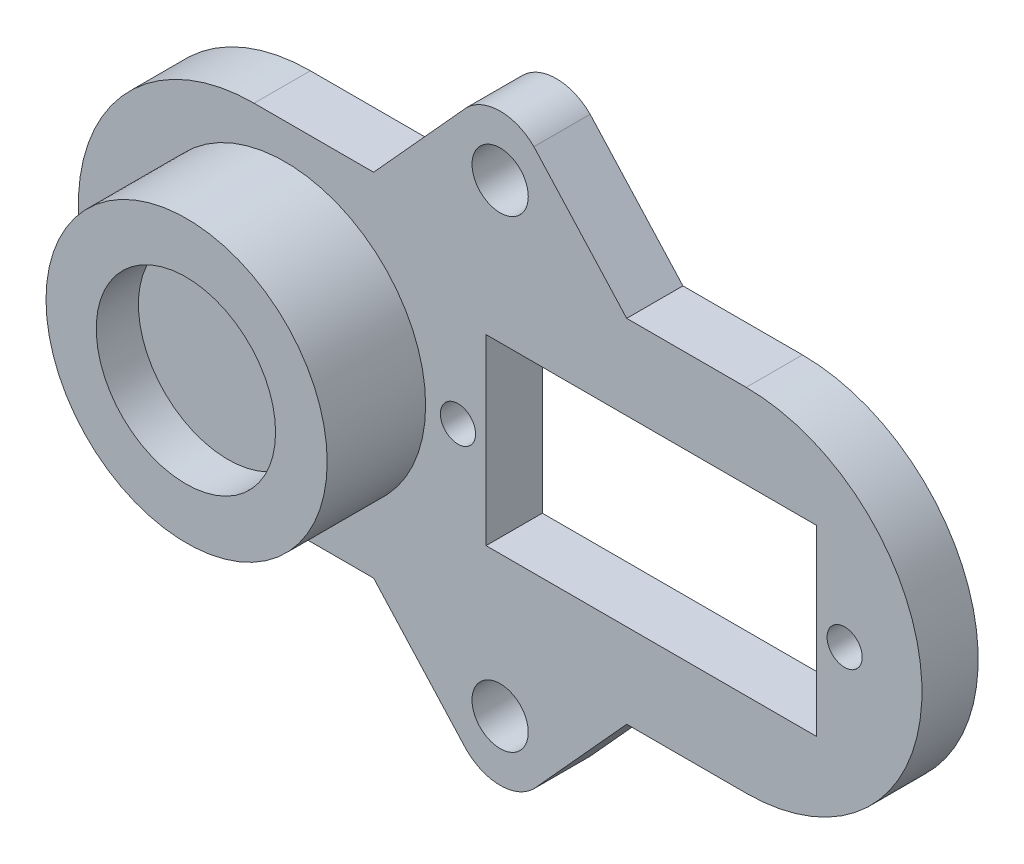
ISO-10303-21;
HEADER;
FILE_DESCRIPTION(('STEP AP214'),'2;1');
FILE_NAME('part.step','',(''),(''),'','','');
FILE_SCHEMA(('AUTOMOTIVE_DESIGN { 1 0 10303 214 1 1 1 1 }'));
ENDSEC;
DATA;
#1=APPLICATION_CONTEXT('core data for automotive mechanical design processes');
#2=APPLICATION_PROTOCOL_DEFINITION('international standard','automotive_design',2000,#1);
#3=PRODUCT_CONTEXT('',#1,'mechanical');
#4=PRODUCT('Part','Part','',(#3));
#5=PRODUCT_RELATED_PRODUCT_CATEGORY('part','',(#4));
#6=PRODUCT_DEFINITION_FORMATION('','',#4);
#7=PRODUCT_DEFINITION_CONTEXT('part definition',#1,'design');
#8=PRODUCT_DEFINITION('design','',#6,#7);
#9=PRODUCT_DEFINITION_SHAPE('','',#8);
#10=(LENGTH_UNIT() NAMED_UNIT(*) SI_UNIT(.MILLI.,.METRE.));
#11=(NAMED_UNIT(*) PLANE_ANGLE_UNIT() SI_UNIT($,.RADIAN.));
#12=(NAMED_UNIT(*) SI_UNIT($,.STERADIAN.) SOLID_ANGLE_UNIT());
#13=UNCERTAINTY_MEASURE_WITH_UNIT(LENGTH_MEASURE(1.E-05),#10,'distance_accuracy_value','');
#14=(GEOMETRIC_REPRESENTATION_CONTEXT(3) GLOBAL_UNCERTAINTY_ASSIGNED_CONTEXT((#13)) GLOBAL_UNIT_ASSIGNED_CONTEXT((#10,
#11,#12)) REPRESENTATION_CONTEXT('',''));
#15=CARTESIAN_POINT('',(0.,0.,0.));
#16=DIRECTION('',(0.,0.,1.));
#17=DIRECTION('',(1.,0.,0.));
#18=AXIS2_PLACEMENT_3D('',#15,#16,#17);
#19=CARTESIAN_POINT('',(17.5,0.,4.));
#20=DIRECTION('',(0.,0.,1.));
#21=DIRECTION('',(1.,0.,0.));
#22=AXIS2_PLACEMENT_3D('',#19,#20,#21);
#23=PLANE('',#22);
#24=CARTESIAN_POINT('',(-15.3,0.,4.));
#25=DIRECTION('',(0.,0.,1.));
#26=DIRECTION('',(1.,0.,0.));
#27=AXIS2_PLACEMENT_3D('',#24,#25,#26);
#28=CIRCLE('',#27,10.);
#29=CARTESIAN_POINT('',(-5.3,0.,4.));
#30=VERTEX_POINT('',#29);
#31=EDGE_CURVE('E582',#30,#30,#28,.T.);
#32=ORIENTED_EDGE('',*,*,#31,.F.);
#33=EDGE_LOOP('',(#32));
#34=FACE_BOUND('',#33,.T.);
#35=CARTESIAN_POINT('',(0.,-16.5,4.));
#36=DIRECTION('',(0.,0.,1.));
#37=DIRECTION('',(-1.,0.,0.));
#38=AXIS2_PLACEMENT_3D('',#35,#36,#37);
#39=CIRCLE('',#38,2.);
#40=CARTESIAN_POINT('',(-2.,-16.5,4.));
#41=VERTEX_POINT('',#40);
#42=EDGE_CURVE('E191',#41,#41,#39,.T.);
#43=ORIENTED_EDGE('',*,*,#42,.F.);
#44=EDGE_LOOP('',(#43));
#45=FACE_BOUND('',#44,.T.);
#46=CARTESIAN_POINT('',(-2.99999999999999,0.,4.));
#47=DIRECTION('',(0.,0.,1.));
#48=DIRECTION('',(1.,0.,0.));
#49=AXIS2_PLACEMENT_3D('',#46,#47,#48);
#50=CIRCLE('',#49,1.25);
#51=CARTESIAN_POINT('',(-1.74999999999999,0.,4.));
#52=VERTEX_POINT('',#51);
#53=EDGE_CURVE('E203',#52,#52,#50,.T.);
#54=ORIENTED_EDGE('',*,*,#53,.F.);
#55=EDGE_LOOP('',(#54));
#56=FACE_BOUND('',#55,.T.);
#57=CARTESIAN_POINT('',(17.5,0.,4.));
#58=DIRECTION('',(0.,0.,1.));
#59=DIRECTION('',(1.,0.,0.));
#60=AXIS2_PLACEMENT_3D('',#57,#58,#59);
#61=CIRCLE('',#60,12.5);
#62=CARTESIAN_POINT('',(17.5,-12.5,4.));
#63=VERTEX_POINT('',#62);
#64=CARTESIAN_POINT('',(17.5,12.5,4.));
#65=VERTEX_POINT('',#64);
#66=EDGE_CURVE('E209',#63,#65,#61,.T.);
#67=ORIENTED_EDGE('',*,*,#66,.T.);
#68=DIRECTION('',(-1.,0.,0.));
#69=VECTOR('',#68,1.);
#70=CARTESIAN_POINT('',(9.,12.5,4.));
#71=LINE('',#70,#69);
#72=CARTESIAN_POINT('',(9.,12.5,4.));
#73=VERTEX_POINT('',#72);
#74=EDGE_CURVE('E212',#65,#73,#71,.T.);
#75=ORIENTED_EDGE('',*,*,#74,.T.);
#76=DIRECTION('',(-0.671988671110962,0.740561426148111,0.));
#77=VECTOR('',#76,1.);
#78=CARTESIAN_POINT('',(2.4010102843855,19.772380391254,4.));
#79=LINE('',#78,#77);
#80=CARTESIAN_POINT('',(2.4010102843855,19.772380391254,4.));
#81=VERTEX_POINT('',#80);
#82=EDGE_CURVE('E215',#73,#81,#79,.T.);
#83=ORIENTED_EDGE('',*,*,#82,.T.);
#84=CARTESIAN_POINT('',(0.,17.3713701068685,4.));
#85=DIRECTION('',(0.,0.,1.));
#86=DIRECTION('',(-1.,0.,0.));
#87=AXIS2_PLACEMENT_3D('',#84,#85,#86);
#88=CIRCLE('',#87,3.39554130757526);
#89=CARTESIAN_POINT('',(-2.4010102843855,19.772380391254,4.));
#90=VERTEX_POINT('',#89);
#91=EDGE_CURVE('E217',#81,#90,#88,.T.);
#92=ORIENTED_EDGE('',*,*,#91,.T.);
#93=DIRECTION('',(-0.671988671110962,-0.740561426148111,0.));
#94=VECTOR('',#93,1.);
#95=CARTESIAN_POINT('',(-9.,12.5,4.));
#96=LINE('',#95,#94);
#97=CARTESIAN_POINT('',(-9.,12.5,4.));
#98=VERTEX_POINT('',#97);
#99=EDGE_CURVE('E219',#90,#98,#96,.T.);
#100=ORIENTED_EDGE('',*,*,#99,.T.);
#101=DIRECTION('',(-1.,0.,0.));
#102=VECTOR('',#101,1.);
#103=CARTESIAN_POINT('',(-17.5,12.5,4.));
#104=LINE('',#103,#102);
#105=CARTESIAN_POINT('',(-17.5,12.5,4.));
#106=VERTEX_POINT('',#105);
#107=EDGE_CURVE('E221',#98,#106,#104,.T.);
#108=ORIENTED_EDGE('',*,*,#107,.T.);
#109=CARTESIAN_POINT('',(-17.5,0.,4.));
#110=DIRECTION('',(0.,0.,1.));
#111=DIRECTION('',(1.,0.,0.));
#112=AXIS2_PLACEMENT_3D('',#109,#110,#111);
#113=CIRCLE('',#112,12.5);
#114=CARTESIAN_POINT('',(-17.5,-12.5,4.));
#115=VERTEX_POINT('',#114);
#116=EDGE_CURVE('E223',#106,#115,#113,.T.);
#117=ORIENTED_EDGE('',*,*,#116,.T.);
#118=DIRECTION('',(1.,0.,0.));
#119=VECTOR('',#118,1.);
#120=CARTESIAN_POINT('',(-17.5,-12.5,4.));
#121=LINE('',#120,#119);
#122=CARTESIAN_POINT('',(-9.,-12.5,4.));
#123=VERTEX_POINT('',#122);
#124=EDGE_CURVE('E225',#115,#123,#121,.T.);
#125=ORIENTED_EDGE('',*,*,#124,.T.);
#126=DIRECTION('',(0.671988671110962,-0.740561426148111,0.));
#127=VECTOR('',#126,1.);
#128=CARTESIAN_POINT('',(-9.,-12.5,4.));
#129=LINE('',#128,#127);
#130=CARTESIAN_POINT('',(-2.4010102843855,-19.772380391254,4.));
#131=VERTEX_POINT('',#130);
#132=EDGE_CURVE('E227',#123,#131,#129,.T.);
#133=ORIENTED_EDGE('',*,*,#132,.T.);
#134=CARTESIAN_POINT('',(0.,-17.3713701068685,4.));
#135=DIRECTION('',(0.,0.,1.));
#136=DIRECTION('',(1.,0.,0.));
#137=AXIS2_PLACEMENT_3D('',#134,#135,#136);
#138=CIRCLE('',#137,3.39554130757526);
#139=CARTESIAN_POINT('',(2.4010102843855,-19.772380391254,4.));
#140=VERTEX_POINT('',#139);
#141=EDGE_CURVE('E229',#131,#140,#138,.T.);
#142=ORIENTED_EDGE('',*,*,#141,.T.);
#143=DIRECTION('',(0.671988671110962,0.740561426148111,0.));
#144=VECTOR('',#143,1.);
#145=CARTESIAN_POINT('',(2.4010102843855,-19.772380391254,4.));
#146=LINE('',#145,#144);
#147=CARTESIAN_POINT('',(9.,-12.5,4.));
#148=VERTEX_POINT('',#147);
#149=EDGE_CURVE('E231',#140,#148,#146,.T.);
#150=ORIENTED_EDGE('',*,*,#149,.T.);
#151=DIRECTION('',(1.,0.,0.));
#152=VECTOR('',#151,1.);
#153=CARTESIAN_POINT('',(9.,-12.5,4.));
#154=LINE('',#153,#152);
#155=EDGE_CURVE('E233',#148,#63,#154,.T.);
#156=ORIENTED_EDGE('',*,*,#155,.T.);
#157=EDGE_LOOP('',(#67,#75,#83,#92,#100,#108,#117,#125,#133,#142,#150,#156));
#158=FACE_BOUND('',#157,.T.);
#159=CARTESIAN_POINT('',(0.,16.5,4.));
#160=DIRECTION('',(0.,0.,1.));
#161=DIRECTION('',(1.,0.,0.));
#162=AXIS2_PLACEMENT_3D('',#159,#160,#161);
#163=CIRCLE('',#162,2.);
#164=CARTESIAN_POINT('',(2.,16.5,4.));
#165=VERTEX_POINT('',#164);
#166=EDGE_CURVE('E197',#165,#165,#163,.T.);
#167=ORIENTED_EDGE('',*,*,#166,.F.);
#168=EDGE_LOOP('',(#167));
#169=FACE_BOUND('',#168,.T.);
#170=CARTESIAN_POINT('',(24.5,0.,4.));
#171=DIRECTION('',(0.,0.,1.));
#172=DIRECTION('',(1.,0.,0.));
#173=AXIS2_PLACEMENT_3D('',#170,#171,#172);
#174=CIRCLE('',#173,1.25);
#175=CARTESIAN_POINT('',(25.75,0.,4.));
#176=VERTEX_POINT('',#175);
#177=EDGE_CURVE('E185',#176,#176,#174,.T.);
#178=ORIENTED_EDGE('',*,*,#177,.F.);
#179=EDGE_LOOP('',(#178));
#180=FACE_BOUND('',#179,.T.);
#181=DIRECTION('',(1.,0.,0.));
#182=VECTOR('',#181,1.);
#183=CARTESIAN_POINT('',(-0.999999999999994,-6.5,4.));
#184=LINE('',#183,#182);
#185=CARTESIAN_POINT('',(-0.999999999999994,-6.5,4.));
#186=VERTEX_POINT('',#185);
#187=CARTESIAN_POINT('',(22.5,-6.5,4.));
#188=VERTEX_POINT('',#187);
#189=EDGE_CURVE('E155',#186,#188,#184,.T.);
#190=ORIENTED_EDGE('',*,*,#189,.F.);
#191=DIRECTION('',(0.,-1.,0.));
#192=VECTOR('',#191,1.);
#193=CARTESIAN_POINT('',(-0.999999999999994,6.5,4.));
#194=LINE('',#193,#192);
#195=CARTESIAN_POINT('',(-0.999999999999994,6.5,4.));
#196=VERTEX_POINT('',#195);
#197=EDGE_CURVE('E147',#196,#186,#194,.T.);
#198=ORIENTED_EDGE('',*,*,#197,.F.);
#199=DIRECTION('',(-1.,0.,0.));
#200=VECTOR('',#199,1.);
#201=CARTESIAN_POINT('',(-0.999999999999994,6.5,4.));
#202=LINE('',#201,#200);
#203=CARTESIAN_POINT('',(22.5,6.5,4.));
#204=VERTEX_POINT('',#203);
#205=EDGE_CURVE('E169',#204,#196,#202,.T.);
#206=ORIENTED_EDGE('',*,*,#205,.F.);
#207=DIRECTION('',(0.,1.,0.));
#208=VECTOR('',#207,1.);
#209=CARTESIAN_POINT('',(22.5,6.5,4.));
#210=LINE('',#209,#208);
#211=EDGE_CURVE('E167',#188,#204,#210,.T.);
#212=ORIENTED_EDGE('',*,*,#211,.F.);
#213=EDGE_LOOP('',(#190,#198,#206,#212));
#214=FACE_BOUND('',#213,.T.);
#215=ADVANCED_FACE('F34',(#34,#45,#56,#158,#169,#180,#214),#23,.T.);
#216=CARTESIAN_POINT('',(17.5,0.,0.));
#217=DIRECTION('',(0.,0.,1.));
#218=DIRECTION('',(1.,0.,0.));
#219=AXIS2_PLACEMENT_3D('',#216,#217,#218);
#220=PLANE('',#219);
#221=CARTESIAN_POINT('',(24.5,0.,0.));
#222=DIRECTION('',(0.,0.,1.));
#223=DIRECTION('',(1.,0.,0.));
#224=AXIS2_PLACEMENT_3D('',#221,#222,#223);
#225=CIRCLE('',#224,1.25);
#226=CARTESIAN_POINT('',(25.75,0.,0.));
#227=VERTEX_POINT('',#226);
#228=EDGE_CURVE('E163',#227,#227,#225,.T.);
#229=ORIENTED_EDGE('',*,*,#228,.T.);
#230=EDGE_LOOP('',(#229));
#231=FACE_BOUND('',#230,.T.);
#232=CARTESIAN_POINT('',(0.,-16.5,0.));
#233=DIRECTION('',(0.,0.,1.));
#234=DIRECTION('',(-1.,0.,0.));
#235=AXIS2_PLACEMENT_3D('',#232,#233,#234);
#236=CIRCLE('',#235,2.);
#237=CARTESIAN_POINT('',(-2.,-16.5,0.));
#238=VERTEX_POINT('',#237);
#239=EDGE_CURVE('E188',#238,#238,#236,.T.);
#240=ORIENTED_EDGE('',*,*,#239,.T.);
#241=EDGE_LOOP('',(#240));
#242=FACE_BOUND('',#241,.T.);
#243=CARTESIAN_POINT('',(0.,16.5,0.));
#244=DIRECTION('',(0.,0.,1.));
#245=DIRECTION('',(1.,0.,0.));
#246=AXIS2_PLACEMENT_3D('',#243,#244,#245);
#247=CIRCLE('',#246,2.);
#248=CARTESIAN_POINT('',(2.,16.5,0.));
#249=VERTEX_POINT('',#248);
#250=EDGE_CURVE('E194',#249,#249,#247,.T.);
#251=ORIENTED_EDGE('',*,*,#250,.T.);
#252=EDGE_LOOP('',(#251));
#253=FACE_BOUND('',#252,.T.);
#254=CARTESIAN_POINT('',(-2.99999999999999,0.,0.));
#255=DIRECTION('',(0.,0.,1.));
#256=DIRECTION('',(1.,0.,0.));
#257=AXIS2_PLACEMENT_3D('',#254,#255,#256);
#258=CIRCLE('',#257,1.25);
#259=CARTESIAN_POINT('',(-1.74999999999999,0.,0.));
#260=VERTEX_POINT('',#259);
#261=EDGE_CURVE('E200',#260,#260,#258,.T.);
#262=ORIENTED_EDGE('',*,*,#261,.T.);
#263=EDGE_LOOP('',(#262));
#264=FACE_BOUND('',#263,.T.);
#265=CARTESIAN_POINT('',(17.5,0.,0.));
#266=DIRECTION('',(0.,0.,1.));
#267=DIRECTION('',(1.,0.,0.));
#268=AXIS2_PLACEMENT_3D('',#265,#266,#267);
#269=CIRCLE('',#268,12.5);
#270=CARTESIAN_POINT('',(17.5,-12.5,0.));
#271=VERTEX_POINT('',#270);
#272=CARTESIAN_POINT('',(17.5,12.5,0.));
#273=VERTEX_POINT('',#272);
#274=EDGE_CURVE('E206',#271,#273,#269,.T.);
#275=ORIENTED_EDGE('',*,*,#274,.F.);
#276=DIRECTION('',(1.,0.,0.));
#277=VECTOR('',#276,1.);
#278=CARTESIAN_POINT('',(9.,-12.5,0.));
#279=LINE('',#278,#277);
#280=CARTESIAN_POINT('',(9.,-12.5,0.));
#281=VERTEX_POINT('',#280);
#282=EDGE_CURVE('E213',#281,#271,#279,.T.);
#283=ORIENTED_EDGE('',*,*,#282,.F.);
#284=DIRECTION('',(0.671988671110962,0.740561426148111,0.));
#285=VECTOR('',#284,1.);
#286=CARTESIAN_POINT('',(2.4010102843855,-19.772380391254,0.));
#287=LINE('',#286,#285);
#288=CARTESIAN_POINT('',(2.4010102843855,-19.772380391254,0.));
#289=VERTEX_POINT('',#288);
#290=EDGE_CURVE('E256',#289,#281,#287,.T.);
#291=ORIENTED_EDGE('',*,*,#290,.F.);
#292=CARTESIAN_POINT('',(0.,-17.3713701068685,0.));
#293=DIRECTION('',(0.,0.,1.));
#294=DIRECTION('',(1.,0.,0.));
#295=AXIS2_PLACEMENT_3D('',#292,#293,#294);
#296=CIRCLE('',#295,3.39554130757526);
#297=CARTESIAN_POINT('',(-2.4010102843855,-19.772380391254,0.));
#298=VERTEX_POINT('',#297);
#299=EDGE_CURVE('E254',#298,#289,#296,.T.);
#300=ORIENTED_EDGE('',*,*,#299,.F.);
#301=DIRECTION('',(0.671988671110962,-0.740561426148111,0.));
#302=VECTOR('',#301,1.);
#303=CARTESIAN_POINT('',(-9.,-12.5,0.));
#304=LINE('',#303,#302);
#305=CARTESIAN_POINT('',(-9.,-12.5,0.));
#306=VERTEX_POINT('',#305);
#307=EDGE_CURVE('E252',#306,#298,#304,.T.);
#308=ORIENTED_EDGE('',*,*,#307,.F.);
#309=DIRECTION('',(1.,0.,0.));
#310=VECTOR('',#309,1.);
#311=CARTESIAN_POINT('',(-17.5,-12.5,0.));
#312=LINE('',#311,#310);
#313=CARTESIAN_POINT('',(-17.5,-12.5,0.));
#314=VERTEX_POINT('',#313);
#315=EDGE_CURVE('E250',#314,#306,#312,.T.);
#316=ORIENTED_EDGE('',*,*,#315,.F.);
#317=CARTESIAN_POINT('',(-17.5,0.,0.));
#318=DIRECTION('',(0.,0.,1.));
#319=DIRECTION('',(1.,0.,0.));
#320=AXIS2_PLACEMENT_3D('',#317,#318,#319);
#321=CIRCLE('',#320,12.5);
#322=CARTESIAN_POINT('',(-17.5,12.5,0.));
#323=VERTEX_POINT('',#322);
#324=EDGE_CURVE('E248',#323,#314,#321,.T.);
#325=ORIENTED_EDGE('',*,*,#324,.F.);
#326=DIRECTION('',(-1.,0.,0.));
#327=VECTOR('',#326,1.);
#328=CARTESIAN_POINT('',(-17.5,12.5,0.));
#329=LINE('',#328,#327);
#330=CARTESIAN_POINT('',(-9.,12.5,0.));
#331=VERTEX_POINT('',#330);
#332=EDGE_CURVE('E246',#331,#323,#329,.T.);
#333=ORIENTED_EDGE('',*,*,#332,.F.);
#334=DIRECTION('',(-0.671988671110962,-0.740561426148111,0.));
#335=VECTOR('',#334,1.);
#336=CARTESIAN_POINT('',(-9.,12.5,0.));
#337=LINE('',#336,#335);
#338=CARTESIAN_POINT('',(-2.4010102843855,19.772380391254,0.));
#339=VERTEX_POINT('',#338);
#340=EDGE_CURVE('E244',#339,#331,#337,.T.);
#341=ORIENTED_EDGE('',*,*,#340,.F.);
#342=CARTESIAN_POINT('',(0.,17.3713701068685,0.));
#343=DIRECTION('',(0.,0.,1.));
#344=DIRECTION('',(-1.,0.,0.));
#345=AXIS2_PLACEMENT_3D('',#342,#343,#344);
#346=CIRCLE('',#345,3.39554130757526);
#347=CARTESIAN_POINT('',(2.4010102843855,19.772380391254,0.));
#348=VERTEX_POINT('',#347);
#349=EDGE_CURVE('E242',#348,#339,#346,.T.);
#350=ORIENTED_EDGE('',*,*,#349,.F.);
#351=DIRECTION('',(-0.671988671110962,0.740561426148111,0.));
#352=VECTOR('',#351,1.);
#353=CARTESIAN_POINT('',(2.4010102843855,19.772380391254,0.));
#354=LINE('',#353,#352);
#355=CARTESIAN_POINT('',(9.,12.5,0.));
#356=VERTEX_POINT('',#355);
#357=EDGE_CURVE('E240',#356,#348,#354,.T.);
#358=ORIENTED_EDGE('',*,*,#357,.F.);
#359=DIRECTION('',(-1.,0.,0.));
#360=VECTOR('',#359,1.);
#361=CARTESIAN_POINT('',(9.,12.5,0.));
#362=LINE('',#361,#360);
#363=EDGE_CURVE('E238',#273,#356,#362,.T.);
#364=ORIENTED_EDGE('',*,*,#363,.F.);
#365=EDGE_LOOP('',(#275,#283,#291,#300,#308,#316,#325,#333,#341,#350,#358,#364));
#366=FACE_BOUND('',#365,.T.);
#367=DIRECTION('',(0.,-1.,0.));
#368=VECTOR('',#367,1.);
#369=CARTESIAN_POINT('',(-0.999999999999994,6.5,0.));
#370=LINE('',#369,#368);
#371=CARTESIAN_POINT('',(-0.999999999999994,6.5,0.));
#372=VERTEX_POINT('',#371);
#373=CARTESIAN_POINT('',(-0.999999999999994,-6.5,0.));
#374=VERTEX_POINT('',#373);
#375=EDGE_CURVE('E57',#372,#374,#370,.T.);
#376=ORIENTED_EDGE('',*,*,#375,.T.);
#377=DIRECTION('',(1.,0.,0.));
#378=VECTOR('',#377,1.);
#379=CARTESIAN_POINT('',(-0.999999999999994,-6.5,0.));
#380=LINE('',#379,#378);
#381=CARTESIAN_POINT('',(22.5,-6.5,0.));
#382=VERTEX_POINT('',#381);
#383=EDGE_CURVE('E162',#374,#382,#380,.T.);
#384=ORIENTED_EDGE('',*,*,#383,.T.);
#385=DIRECTION('',(0.,1.,0.));
#386=VECTOR('',#385,1.);
#387=CARTESIAN_POINT('',(22.5,6.5,0.));
#388=LINE('',#387,#386);
#389=CARTESIAN_POINT('',(22.5,6.5,0.));
#390=VERTEX_POINT('',#389);
#391=EDGE_CURVE('E177',#382,#390,#388,.T.);
#392=ORIENTED_EDGE('',*,*,#391,.T.);
#393=DIRECTION('',(-1.,0.,0.));
#394=VECTOR('',#393,1.);
#395=CARTESIAN_POINT('',(-0.999999999999994,6.5,0.));
#396=LINE('',#395,#394);
#397=EDGE_CURVE('E156',#390,#372,#396,.T.);
#398=ORIENTED_EDGE('',*,*,#397,.T.);
#399=EDGE_LOOP('',(#376,#384,#392,#398));
#400=FACE_BOUND('',#399,.T.);
#401=ADVANCED_FACE('F298',(#231,#242,#253,#264,#366,#400),#220,.F.);
#402=CARTESIAN_POINT('',(17.5,0.,4.));
#403=DIRECTION('',(0.,0.,-1.));
#404=DIRECTION('',(-1.,0.,0.));
#405=AXIS2_PLACEMENT_3D('',#402,#403,#404);
#406=CYLINDRICAL_SURFACE('',#405,12.5);
#407=ORIENTED_EDGE('',*,*,#274,.T.);
#408=DIRECTION('',(0.,0.,-1.));
#409=VECTOR('',#408,1.);
#410=CARTESIAN_POINT('',(17.5,12.5,4.));
#411=LINE('',#410,#409);
#412=EDGE_CURVE('E11',#65,#273,#411,.T.);
#413=ORIENTED_EDGE('',*,*,#412,.F.);
#414=ORIENTED_EDGE('',*,*,#66,.F.);
#415=DIRECTION('',(0.,0.,-1.));
#416=VECTOR('',#415,1.);
#417=CARTESIAN_POINT('',(17.5,-12.5,4.));
#418=LINE('',#417,#416);
#419=EDGE_CURVE('E235',#63,#271,#418,.T.);
#420=ORIENTED_EDGE('',*,*,#419,.T.);
#421=EDGE_LOOP('',(#407,#413,#414,#420));
#422=FACE_BOUND('',#421,.T.);
#423=ADVANCED_FACE('F36',(#422),#406,.T.);
#424=CARTESIAN_POINT('',(9.,12.5,4.));
#425=DIRECTION('',(0.,-1.,0.));
#426=DIRECTION('',(1.,0.,0.));
#427=AXIS2_PLACEMENT_3D('',#424,#425,#426);
#428=PLANE('',#427);
#429=ORIENTED_EDGE('',*,*,#363,.T.);
#430=DIRECTION('',(0.,0.,-1.));
#431=VECTOR('',#430,1.);
#432=CARTESIAN_POINT('',(9.,12.5,4.));
#433=LINE('',#432,#431);
#434=EDGE_CURVE('E42',#73,#356,#433,.T.);
#435=ORIENTED_EDGE('',*,*,#434,.F.);
#436=ORIENTED_EDGE('',*,*,#74,.F.);
#437=ORIENTED_EDGE('',*,*,#412,.T.);
#438=EDGE_LOOP('',(#429,#435,#436,#437));
#439=FACE_BOUND('',#438,.T.);
#440=ADVANCED_FACE('F316',(#439),#428,.F.);
#441=CARTESIAN_POINT('',(2.4010102843855,19.772380391254,4.));
#442=DIRECTION('',(-0.740561426148111,-0.671988671110962,0.));
#443=DIRECTION('',(0.671988671110962,-0.740561426148111,0.));
#444=AXIS2_PLACEMENT_3D('',#441,#442,#443);
#445=PLANE('',#444);
#446=ORIENTED_EDGE('',*,*,#357,.T.);
#447=DIRECTION('',(0.,0.,-1.));
#448=VECTOR('',#447,1.);
#449=CARTESIAN_POINT('',(2.4010102843855,19.772380391254,4.));
#450=LINE('',#449,#448);
#451=EDGE_CURVE('E285',#81,#348,#450,.T.);
#452=ORIENTED_EDGE('',*,*,#451,.F.);
#453=ORIENTED_EDGE('',*,*,#82,.F.);
#454=ORIENTED_EDGE('',*,*,#434,.T.);
#455=EDGE_LOOP('',(#446,#452,#453,#454));
#456=FACE_BOUND('',#455,.T.);
#457=ADVANCED_FACE('F292',(#456),#445,.F.);
#458=CARTESIAN_POINT('',(0.,17.3713701068685,4.));
#459=DIRECTION('',(0.,0.,-1.));
#460=DIRECTION('',(-1.,0.,0.));
#461=AXIS2_PLACEMENT_3D('',#458,#459,#460);
#462=CYLINDRICAL_SURFACE('',#461,3.39554130757526);
#463=ORIENTED_EDGE('',*,*,#349,.T.);
#464=DIRECTION('',(0.,0.,-1.));
#465=VECTOR('',#464,1.);
#466=CARTESIAN_POINT('',(-2.4010102843855,19.772380391254,4.));
#467=LINE('',#466,#465);
#468=EDGE_CURVE('E282',#90,#339,#467,.T.);
#469=ORIENTED_EDGE('',*,*,#468,.F.);
#470=ORIENTED_EDGE('',*,*,#91,.F.);
#471=ORIENTED_EDGE('',*,*,#451,.T.);
#472=EDGE_LOOP('',(#463,#469,#470,#471));
#473=FACE_BOUND('',#472,.T.);
#474=ADVANCED_FACE('F304',(#473),#462,.T.);
#475=CARTESIAN_POINT('',(-9.,12.5,4.));
#476=DIRECTION('',(0.740561426148111,-0.671988671110962,0.));
#477=DIRECTION('',(0.671988671110962,0.740561426148111,0.));
#478=AXIS2_PLACEMENT_3D('',#475,#476,#477);
#479=PLANE('',#478);
#480=ORIENTED_EDGE('',*,*,#340,.T.);
#481=DIRECTION('',(0.,0.,-1.));
#482=VECTOR('',#481,1.);
#483=CARTESIAN_POINT('',(-9.,12.5,4.));
#484=LINE('',#483,#482);
#485=EDGE_CURVE('E279',#98,#331,#484,.T.);
#486=ORIENTED_EDGE('',*,*,#485,.F.);
#487=ORIENTED_EDGE('',*,*,#99,.F.);
#488=ORIENTED_EDGE('',*,*,#468,.T.);
#489=EDGE_LOOP('',(#480,#486,#487,#488));
#490=FACE_BOUND('',#489,.T.);
#491=ADVANCED_FACE('F308',(#490),#479,.F.);
#492=CARTESIAN_POINT('',(-17.5,12.5,4.));
#493=DIRECTION('',(0.,-1.,0.));
#494=DIRECTION('',(1.,0.,0.));
#495=AXIS2_PLACEMENT_3D('',#492,#493,#494);
#496=PLANE('',#495);
#497=ORIENTED_EDGE('',*,*,#332,.T.);
#498=DIRECTION('',(0.,0.,-1.));
#499=VECTOR('',#498,1.);
#500=CARTESIAN_POINT('',(-17.5,12.5,4.));
#501=LINE('',#500,#499);
#502=EDGE_CURVE('E276',#106,#323,#501,.T.);
#503=ORIENTED_EDGE('',*,*,#502,.F.);
#504=ORIENTED_EDGE('',*,*,#107,.F.);
#505=ORIENTED_EDGE('',*,*,#485,.T.);
#506=EDGE_LOOP('',(#497,#503,#504,#505));
#507=FACE_BOUND('',#506,.T.);
#508=ADVANCED_FACE('F349',(#507),#496,.F.);
#509=CARTESIAN_POINT('',(-17.5,0.,4.));
#510=DIRECTION('',(0.,0.,-1.));
#511=DIRECTION('',(-1.,0.,0.));
#512=AXIS2_PLACEMENT_3D('',#509,#510,#511);
#513=CYLINDRICAL_SURFACE('',#512,12.5);
#514=ORIENTED_EDGE('',*,*,#324,.T.);
#515=DIRECTION('',(0.,0.,-1.));
#516=VECTOR('',#515,1.);
#517=CARTESIAN_POINT('',(-17.5,-12.5,4.));
#518=LINE('',#517,#516);
#519=EDGE_CURVE('E273',#115,#314,#518,.T.);
#520=ORIENTED_EDGE('',*,*,#519,.F.);
#521=ORIENTED_EDGE('',*,*,#116,.F.);
#522=ORIENTED_EDGE('',*,*,#502,.T.);
#523=EDGE_LOOP('',(#514,#520,#521,#522));
#524=FACE_BOUND('',#523,.T.);
#525=ADVANCED_FACE('F347',(#524),#513,.T.);
#526=CARTESIAN_POINT('',(-17.5,-12.5,4.));
#527=DIRECTION('',(0.,1.,0.));
#528=DIRECTION('',(-1.,0.,0.));
#529=AXIS2_PLACEMENT_3D('',#526,#527,#528);
#530=PLANE('',#529);
#531=ORIENTED_EDGE('',*,*,#315,.T.);
#532=DIRECTION('',(0.,0.,-1.));
#533=VECTOR('',#532,1.);
#534=CARTESIAN_POINT('',(-9.,-12.5,4.));
#535=LINE('',#534,#533);
#536=EDGE_CURVE('E270',#123,#306,#535,.T.);
#537=ORIENTED_EDGE('',*,*,#536,.F.);
#538=ORIENTED_EDGE('',*,*,#124,.F.);
#539=ORIENTED_EDGE('',*,*,#519,.T.);
#540=EDGE_LOOP('',(#531,#537,#538,#539));
#541=FACE_BOUND('',#540,.T.);
#542=ADVANCED_FACE('F343',(#541),#530,.F.);
#543=CARTESIAN_POINT('',(-9.,-12.5,4.));
#544=DIRECTION('',(0.740561426148111,0.671988671110962,0.));
#545=DIRECTION('',(-0.671988671110962,0.740561426148111,0.));
#546=AXIS2_PLACEMENT_3D('',#543,#544,#545);
#547=PLANE('',#546);
#548=ORIENTED_EDGE('',*,*,#307,.T.);
#549=DIRECTION('',(0.,0.,-1.));
#550=VECTOR('',#549,1.);
#551=CARTESIAN_POINT('',(-2.4010102843855,-19.772380391254,4.));
#552=LINE('',#551,#550);
#553=EDGE_CURVE('E267',#131,#298,#552,.T.);
#554=ORIENTED_EDGE('',*,*,#553,.F.);
#555=ORIENTED_EDGE('',*,*,#132,.F.);
#556=ORIENTED_EDGE('',*,*,#536,.T.);
#557=EDGE_LOOP('',(#548,#554,#555,#556));
#558=FACE_BOUND('',#557,.T.);
#559=ADVANCED_FACE('F338',(#558),#547,.F.);
#560=CARTESIAN_POINT('',(0.,-17.3713701068685,4.));
#561=DIRECTION('',(0.,0.,-1.));
#562=DIRECTION('',(-1.,0.,0.));
#563=AXIS2_PLACEMENT_3D('',#560,#561,#562);
#564=CYLINDRICAL_SURFACE('',#563,3.39554130757526);
#565=ORIENTED_EDGE('',*,*,#299,.T.);
#566=DIRECTION('',(0.,0.,-1.));
#567=VECTOR('',#566,1.);
#568=CARTESIAN_POINT('',(2.4010102843855,-19.772380391254,4.));
#569=LINE('',#568,#567);
#570=EDGE_CURVE('E264',#140,#289,#569,.T.);
#571=ORIENTED_EDGE('',*,*,#570,.F.);
#572=ORIENTED_EDGE('',*,*,#141,.F.);
#573=ORIENTED_EDGE('',*,*,#553,.T.);
#574=EDGE_LOOP('',(#565,#571,#572,#573));
#575=FACE_BOUND('',#574,.T.);
#576=ADVANCED_FACE('F332',(#575),#564,.T.);
#577=CARTESIAN_POINT('',(2.4010102843855,-19.772380391254,4.));
#578=DIRECTION('',(-0.740561426148111,0.671988671110962,0.));
#579=DIRECTION('',(-0.671988671110962,-0.740561426148111,0.));
#580=AXIS2_PLACEMENT_3D('',#577,#578,#579);
#581=PLANE('',#580);
#582=ORIENTED_EDGE('',*,*,#290,.T.);
#583=DIRECTION('',(0.,0.,-1.));
#584=VECTOR('',#583,1.);
#585=CARTESIAN_POINT('',(9.,-12.5,4.));
#586=LINE('',#585,#584);
#587=EDGE_CURVE('E261',#148,#281,#586,.T.);
#588=ORIENTED_EDGE('',*,*,#587,.F.);
#589=ORIENTED_EDGE('',*,*,#149,.F.);
#590=ORIENTED_EDGE('',*,*,#570,.T.);
#591=EDGE_LOOP('',(#582,#588,#589,#590));
#592=FACE_BOUND('',#591,.T.);
#593=ADVANCED_FACE('F328',(#592),#581,.F.);
#594=CARTESIAN_POINT('',(9.,-12.5,4.));
#595=DIRECTION('',(0.,1.,0.));
#596=DIRECTION('',(-1.,0.,0.));
#597=AXIS2_PLACEMENT_3D('',#594,#595,#596);
#598=PLANE('',#597);
#599=ORIENTED_EDGE('',*,*,#282,.T.);
#600=ORIENTED_EDGE('',*,*,#419,.F.);
#601=ORIENTED_EDGE('',*,*,#155,.F.);
#602=ORIENTED_EDGE('',*,*,#587,.T.);
#603=EDGE_LOOP('',(#599,#600,#601,#602));
#604=FACE_BOUND('',#603,.T.);
#605=ADVANCED_FACE('F323',(#604),#598,.F.);
#606=CARTESIAN_POINT('',(-2.99999999999999,0.,4.));
#607=DIRECTION('',(0.,0.,-1.));
#608=DIRECTION('',(-1.,0.,0.));
#609=AXIS2_PLACEMENT_3D('',#606,#607,#608);
#610=CYLINDRICAL_SURFACE('',#609,1.25);
#611=ORIENTED_EDGE('',*,*,#53,.T.);
#612=EDGE_LOOP('',(#611));
#613=FACE_BOUND('',#612,.T.);
#614=ORIENTED_EDGE('',*,*,#261,.F.);
#615=EDGE_LOOP('',(#614));
#616=FACE_BOUND('',#615,.T.);
#617=ADVANCED_FACE('F369',(#613,#616),#610,.F.);
#618=CARTESIAN_POINT('',(0.,16.5,4.));
#619=DIRECTION('',(0.,0.,-1.));
#620=DIRECTION('',(-1.,0.,0.));
#621=AXIS2_PLACEMENT_3D('',#618,#619,#620);
#622=CYLINDRICAL_SURFACE('',#621,2.);
#623=ORIENTED_EDGE('',*,*,#166,.T.);
#624=EDGE_LOOP('',(#623));
#625=FACE_BOUND('',#624,.T.);
#626=ORIENTED_EDGE('',*,*,#250,.F.);
#627=EDGE_LOOP('',(#626));
#628=FACE_BOUND('',#627,.T.);
#629=ADVANCED_FACE('F407',(#625,#628),#622,.F.);
#630=CARTESIAN_POINT('',(0.,-16.5,4.));
#631=DIRECTION('',(0.,0.,-1.));
#632=DIRECTION('',(-1.,0.,0.));
#633=AXIS2_PLACEMENT_3D('',#630,#631,#632);
#634=CYLINDRICAL_SURFACE('',#633,2.);
#635=ORIENTED_EDGE('',*,*,#42,.T.);
#636=EDGE_LOOP('',(#635));
#637=FACE_BOUND('',#636,.T.);
#638=ORIENTED_EDGE('',*,*,#239,.F.);
#639=EDGE_LOOP('',(#638));
#640=FACE_BOUND('',#639,.T.);
#641=ADVANCED_FACE('F414',(#637,#640),#634,.F.);
#642=CARTESIAN_POINT('',(24.5,0.,4.));
#643=DIRECTION('',(0.,0.,-1.));
#644=DIRECTION('',(-1.,0.,0.));
#645=AXIS2_PLACEMENT_3D('',#642,#643,#644);
#646=CYLINDRICAL_SURFACE('',#645,1.25);
#647=ORIENTED_EDGE('',*,*,#177,.T.);
#648=EDGE_LOOP('',(#647));
#649=FACE_BOUND('',#648,.T.);
#650=ORIENTED_EDGE('',*,*,#228,.F.);
#651=EDGE_LOOP('',(#650));
#652=FACE_BOUND('',#651,.T.);
#653=ADVANCED_FACE('F421',(#649,#652),#646,.F.);
#654=CARTESIAN_POINT('',(-0.999999999999994,6.5,4.));
#655=DIRECTION('',(1.,0.,0.));
#656=DIRECTION('',(0.,0.,-1.));
#657=AXIS2_PLACEMENT_3D('',#654,#655,#656);
#658=PLANE('',#657);
#659=ORIENTED_EDGE('',*,*,#375,.F.);
#660=DIRECTION('',(0.,0.,-1.));
#661=VECTOR('',#660,1.);
#662=CARTESIAN_POINT('',(-0.999999999999994,6.5,4.));
#663=LINE('',#662,#661);
#664=EDGE_CURVE('E151',#196,#372,#663,.T.);
#665=ORIENTED_EDGE('',*,*,#664,.F.);
#666=ORIENTED_EDGE('',*,*,#197,.T.);
#667=DIRECTION('',(0.,0.,-1.));
#668=VECTOR('',#667,1.);
#669=CARTESIAN_POINT('',(-0.999999999999994,-6.5,4.));
#670=LINE('',#669,#668);
#671=EDGE_CURVE('E150',#186,#374,#670,.T.);
#672=ORIENTED_EDGE('',*,*,#671,.T.);
#673=EDGE_LOOP('',(#659,#665,#666,#672));
#674=FACE_BOUND('',#673,.T.);
#675=ADVANCED_FACE('F149',(#674),#658,.T.);
#676=CARTESIAN_POINT('',(-0.999999999999994,-6.5,4.));
#677=DIRECTION('',(0.,1.,0.));
#678=DIRECTION('',(0.,0.,1.));
#679=AXIS2_PLACEMENT_3D('',#676,#677,#678);
#680=PLANE('',#679);
#681=ORIENTED_EDGE('',*,*,#383,.F.);
#682=ORIENTED_EDGE('',*,*,#671,.F.);
#683=ORIENTED_EDGE('',*,*,#189,.T.);
#684=DIRECTION('',(0.,0.,-1.));
#685=VECTOR('',#684,1.);
#686=CARTESIAN_POINT('',(22.5,-6.5,4.));
#687=LINE('',#686,#685);
#688=EDGE_CURVE('E164',#188,#382,#687,.T.);
#689=ORIENTED_EDGE('',*,*,#688,.T.);
#690=EDGE_LOOP('',(#681,#682,#683,#689));
#691=FACE_BOUND('',#690,.T.);
#692=ADVANCED_FACE('F159',(#691),#680,.T.);
#693=CARTESIAN_POINT('',(22.5,6.5,4.));
#694=DIRECTION('',(-1.,0.,0.));
#695=DIRECTION('',(0.,0.,1.));
#696=AXIS2_PLACEMENT_3D('',#693,#694,#695);
#697=PLANE('',#696);
#698=ORIENTED_EDGE('',*,*,#391,.F.);
#699=ORIENTED_EDGE('',*,*,#688,.F.);
#700=ORIENTED_EDGE('',*,*,#211,.T.);
#701=DIRECTION('',(0.,0.,-1.));
#702=VECTOR('',#701,1.);
#703=CARTESIAN_POINT('',(22.5,6.5,4.));
#704=LINE('',#703,#702);
#705=EDGE_CURVE('E49',#204,#390,#704,.T.);
#706=ORIENTED_EDGE('',*,*,#705,.T.);
#707=EDGE_LOOP('',(#698,#699,#700,#706));
#708=FACE_BOUND('',#707,.T.);
#709=ADVANCED_FACE('F442',(#708),#697,.T.);
#710=CARTESIAN_POINT('',(-0.999999999999994,6.5,4.));
#711=DIRECTION('',(0.,-1.,0.));
#712=DIRECTION('',(0.,0.,-1.));
#713=AXIS2_PLACEMENT_3D('',#710,#711,#712);
#714=PLANE('',#713);
#715=ORIENTED_EDGE('',*,*,#397,.F.);
#716=ORIENTED_EDGE('',*,*,#705,.F.);
#717=ORIENTED_EDGE('',*,*,#205,.T.);
#718=ORIENTED_EDGE('',*,*,#664,.T.);
#719=EDGE_LOOP('',(#715,#716,#717,#718));
#720=FACE_BOUND('',#719,.T.);
#721=ADVANCED_FACE('F449',(#720),#714,.T.);
#722=CARTESIAN_POINT('',(-15.3,0.,11.));
#723=DIRECTION('',(0.,0.,-1.));
#724=DIRECTION('',(-1.,0.,0.));
#725=AXIS2_PLACEMENT_3D('',#722,#723,#724);
#726=CYLINDRICAL_SURFACE('',#725,10.);
#727=CARTESIAN_POINT('',(-15.3,0.,11.));
#728=DIRECTION('',(0.,0.,1.));
#729=DIRECTION('',(1.,0.,0.));
#730=AXIS2_PLACEMENT_3D('',#727,#728,#729);
#731=CIRCLE('',#730,10.);
#732=CARTESIAN_POINT('',(-5.3,0.,11.));
#733=VERTEX_POINT('',#732);
#734=EDGE_CURVE('E175',#733,#733,#731,.T.);
#735=ORIENTED_EDGE('',*,*,#734,.F.);
#736=EDGE_LOOP('',(#735));
#737=FACE_BOUND('',#736,.T.);
#738=ORIENTED_EDGE('',*,*,#31,.T.);
#739=EDGE_LOOP('',(#738));
#740=FACE_BOUND('',#739,.T.);
#741=ADVANCED_FACE('F457',(#737,#740),#726,.T.);
#742=CARTESIAN_POINT('',(-15.3,0.,11.));
#743=DIRECTION('',(0.,0.,1.));
#744=DIRECTION('',(1.,0.,0.));
#745=AXIS2_PLACEMENT_3D('',#742,#743,#744);
#746=PLANE('',#745);
#747=CARTESIAN_POINT('',(-15.35,0.,11.));
#748=DIRECTION('',(0.,0.,1.));
#749=DIRECTION('',(1.,0.,0.));
#750=AXIS2_PLACEMENT_3D('',#747,#748,#749);
#751=CIRCLE('',#750,6.37750619537964);
#752=CARTESIAN_POINT('',(-8.97249380462036,0.,11.));
#753=VERTEX_POINT('',#752);
#754=EDGE_CURVE('E583',#753,#753,#751,.T.);
#755=ORIENTED_EDGE('',*,*,#754,.F.);
#756=EDGE_LOOP('',(#755));
#757=FACE_BOUND('',#756,.T.);
#758=ORIENTED_EDGE('',*,*,#734,.T.);
#759=EDGE_LOOP('',(#758));
#760=FACE_BOUND('',#759,.T.);
#761=ADVANCED_FACE('F464',(#757,#760),#746,.T.);
#762=CARTESIAN_POINT('',(-15.35,0.,8.));
#763=DIRECTION('',(0.,0.,1.));
#764=DIRECTION('',(1.,0.,0.));
#765=AXIS2_PLACEMENT_3D('',#762,#763,#764);
#766=CYLINDRICAL_SURFACE('',#765,6.37750619537964);
#767=CARTESIAN_POINT('',(-15.35,0.,8.));
#768=DIRECTION('',(0.,0.,1.));
#769=DIRECTION('',(1.,0.,0.));
#770=AXIS2_PLACEMENT_3D('',#767,#768,#769);
#771=CIRCLE('',#770,6.37750619537964);
#772=CARTESIAN_POINT('',(-8.97249380462036,0.,8.));
#773=VERTEX_POINT('',#772);
#774=EDGE_CURVE('E581',#773,#773,#771,.T.);
#775=ORIENTED_EDGE('',*,*,#774,.F.);
#776=EDGE_LOOP('',(#775));
#777=FACE_BOUND('',#776,.T.);
#778=ORIENTED_EDGE('',*,*,#754,.T.);
#779=EDGE_LOOP('',(#778));
#780=FACE_BOUND('',#779,.T.);
#781=ADVANCED_FACE('F472',(#777,#780),#766,.F.);
#782=CARTESIAN_POINT('',(-15.35,0.,8.));
#783=DIRECTION('',(0.,0.,1.));
#784=DIRECTION('',(1.,0.,0.));
#785=AXIS2_PLACEMENT_3D('',#782,#783,#784);
#786=PLANE('',#785);
#787=ORIENTED_EDGE('',*,*,#774,.T.);
#788=EDGE_LOOP('',(#787));
#789=FACE_BOUND('',#788,.T.);
#790=ADVANCED_FACE('F480',(#789),#786,.T.);
#791=CLOSED_SHELL('',(#215,#401,#423,#440,#457,#474,#491,#508,#525,#542,#559,#576,#593,#605,
#617,#629,#641,#653,#675,#692,#709,#721,#741,#761,#781,#790));
#792=MANIFOLD_SOLID_BREP('B2',#791);
#793=ADVANCED_BREP_SHAPE_REPRESENTATION('',(#18,#792),#14);
#794=SHAPE_DEFINITION_REPRESENTATION(#9,#793);
ENDSEC;
END-ISO-10303-21;
